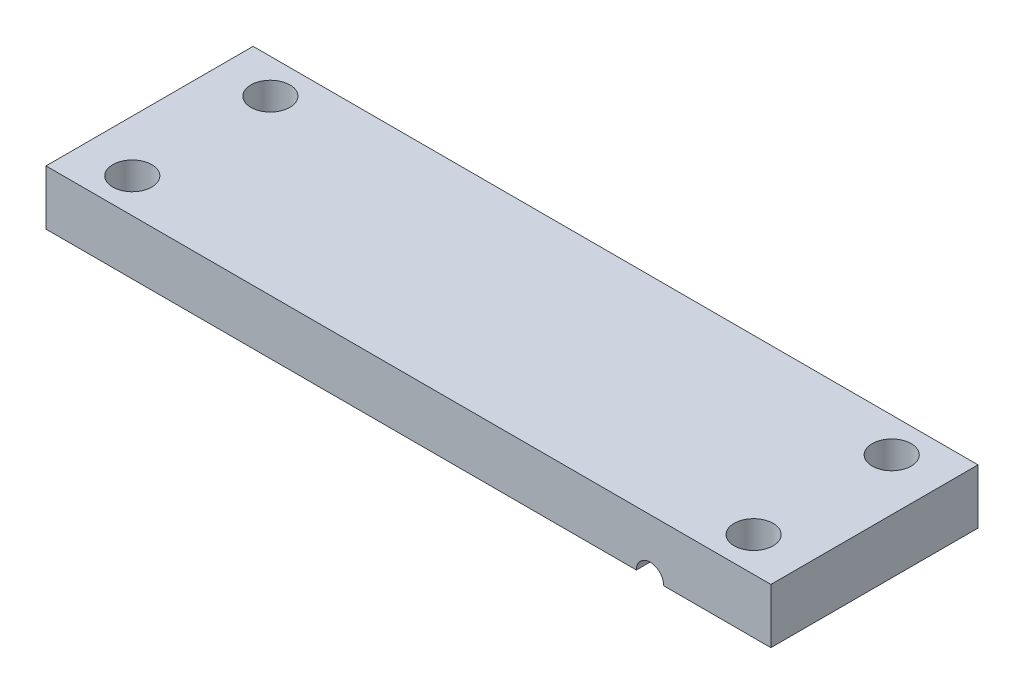
ISO-10303-21;
HEADER;
FILE_DESCRIPTION(('STEP AP214'),'2;1');
FILE_NAME('part.step','',(''),(''),'','','');
FILE_SCHEMA(('AUTOMOTIVE_DESIGN { 1 0 10303 214 1 1 1 1 }'));
ENDSEC;
DATA;
#1=APPLICATION_CONTEXT('core data for automotive mechanical design processes');
#2=APPLICATION_PROTOCOL_DEFINITION('international standard','automotive_design',2000,#1);
#3=PRODUCT_CONTEXT('',#1,'mechanical');
#4=PRODUCT('Part','Part','',(#3));
#5=PRODUCT_RELATED_PRODUCT_CATEGORY('part','',(#4));
#6=PRODUCT_DEFINITION_FORMATION('','',#4);
#7=PRODUCT_DEFINITION_CONTEXT('part definition',#1,'design');
#8=PRODUCT_DEFINITION('design','',#6,#7);
#9=PRODUCT_DEFINITION_SHAPE('','',#8);
#10=(LENGTH_UNIT() NAMED_UNIT(*) SI_UNIT(.MILLI.,.METRE.));
#11=(NAMED_UNIT(*) PLANE_ANGLE_UNIT() SI_UNIT($,.RADIAN.));
#12=(NAMED_UNIT(*) SI_UNIT($,.STERADIAN.) SOLID_ANGLE_UNIT());
#13=UNCERTAINTY_MEASURE_WITH_UNIT(LENGTH_MEASURE(1.E-05),#10,'distance_accuracy_value','');
#14=(GEOMETRIC_REPRESENTATION_CONTEXT(3) GLOBAL_UNCERTAINTY_ASSIGNED_CONTEXT((#13)) GLOBAL_UNIT_ASSIGNED_CONTEXT((#10,
#11,#12)) REPRESENTATION_CONTEXT('',''));
#15=CARTESIAN_POINT('',(0.,0.,0.));
#16=DIRECTION('',(0.,0.,1.));
#17=DIRECTION('',(1.,0.,0.));
#18=AXIS2_PLACEMENT_3D('',#15,#16,#17);
#19=CARTESIAN_POINT('',(0.,0.,0.));
#20=DIRECTION('',(0.,1.,0.));
#21=DIRECTION('',(0.,0.,1.));
#22=AXIS2_PLACEMENT_3D('',#19,#20,#21);
#23=PLANE('',#22);
#24=CARTESIAN_POINT('',(3.,0.,10.));
#25=DIRECTION('',(0.,1.,0.));
#26=DIRECTION('',(0.,0.,1.));
#27=AXIS2_PLACEMENT_3D('',#24,#25,#26);
#28=CIRCLE('',#27,1.1303);
#29=CARTESIAN_POINT('',(3.,0.,11.1303));
#30=VERTEX_POINT('',#29);
#31=EDGE_CURVE('E392',#30,#30,#28,.T.);
#32=ORIENTED_EDGE('',*,*,#31,.T.);
#33=EDGE_LOOP('',(#32));
#34=FACE_BOUND('',#33,.T.);
#35=CARTESIAN_POINT('',(3.,0.,2.));
#36=DIRECTION('',(0.,1.,0.));
#37=DIRECTION('',(0.,0.,1.));
#38=AXIS2_PLACEMENT_3D('',#35,#36,#37);
#39=CIRCLE('',#38,1.1303);
#40=CARTESIAN_POINT('',(3.,0.,3.1303));
#41=VERTEX_POINT('',#40);
#42=EDGE_CURVE('E421',#41,#41,#39,.T.);
#43=ORIENTED_EDGE('',*,*,#42,.T.);
#44=EDGE_LOOP('',(#43));
#45=FACE_BOUND('',#44,.T.);
#46=DIRECTION('',(-0.857492925712544,0.,-0.514495755427527));
#47=VECTOR('',#46,1.);
#48=CARTESIAN_POINT('',(8.81647440489951,0.,8.56422102963302));
#49=LINE('',#48,#47);
#50=CARTESIAN_POINT('',(3.4083810058706,0.,5.31936499021567));
#51=VERTEX_POINT('',#50);
#52=CARTESIAN_POINT('',(6.20625,0.,6.99808638669331));
#53=VERTEX_POINT('',#52);
#54=EDGE_CURVE('E195',#51,#53,#49,.F.);
#55=ORIENTED_EDGE('',*,*,#54,.F.);
#56=DIRECTION('',(0.514495755427527,0.,-0.857492925712544));
#57=VECTOR('',#56,1.);
#58=CARTESIAN_POINT('',(4.85294117647059,0.,2.91176470588236));
#59=LINE('',#58,#57);
#60=CARTESIAN_POINT('',(2.5916189941294,0.,6.68063500978433));
#61=VERTEX_POINT('',#60);
#62=EDGE_CURVE('E11',#61,#51,#59,.T.);
#63=ORIENTED_EDGE('',*,*,#62,.F.);
#64=DIRECTION('',(-0.857492925712544,0.,-0.514495755427527));
#65=VECTOR('',#64,1.);
#66=CARTESIAN_POINT('',(7.99971239315831,0.,9.92549104920169));
#67=LINE('',#66,#65);
#68=CARTESIAN_POINT('',(6.25483464039439,0.,8.87856439754333));
#69=VERTEX_POINT('',#68);
#70=EDGE_CURVE('E203',#69,#61,#67,.T.);
#71=ORIENTED_EDGE('',*,*,#70,.F.);
#72=CARTESIAN_POINT('',(8.5875,0.,8.4));
#73=DIRECTION('',(0.,1.,0.));
#74=DIRECTION('',(0.,0.,1.));
#75=AXIS2_PLACEMENT_3D('',#72,#73,#74);
#76=CIRCLE('',#75,2.38125);
#77=CARTESIAN_POINT('',(10.96875,0.,8.4));
#78=VERTEX_POINT('',#77);
#79=EDGE_CURVE('E218',#78,#69,#76,.F.);
#80=ORIENTED_EDGE('',*,*,#79,.F.);
#81=DIRECTION('',(0.,0.,-1.));
#82=VECTOR('',#81,1.);
#83=CARTESIAN_POINT('',(10.96875,0.,8.4));
#84=LINE('',#83,#82);
#85=CARTESIAN_POINT('',(10.96875,0.,4.9));
#86=VERTEX_POINT('',#85);
#87=EDGE_CURVE('E222',#86,#78,#84,.F.);
#88=ORIENTED_EDGE('',*,*,#87,.F.);
#89=CARTESIAN_POINT('',(11.7625,0.,4.9));
#90=DIRECTION('',(0.,-1.,0.));
#91=DIRECTION('',(0.,0.,-1.));
#92=AXIS2_PLACEMENT_3D('',#89,#90,#91);
#93=CIRCLE('',#92,0.79375);
#94=CARTESIAN_POINT('',(12.55625,0.,4.9));
#95=VERTEX_POINT('',#94);
#96=EDGE_CURVE('E497',#95,#86,#93,.F.);
#97=ORIENTED_EDGE('',*,*,#96,.F.);
#98=DIRECTION('',(0.,0.,1.));
#99=VECTOR('',#98,1.);
#100=CARTESIAN_POINT('',(12.55625,0.,4.9));
#101=LINE('',#100,#99);
#102=CARTESIAN_POINT('',(12.55625,0.,8.17500000000001));
#103=VERTEX_POINT('',#102);
#104=EDGE_CURVE('E495',#103,#95,#101,.F.);
#105=ORIENTED_EDGE('',*,*,#104,.F.);
#106=CARTESIAN_POINT('',(14.9375,0.,8.17500000000001));
#107=DIRECTION('',(0.,1.,0.));
#108=DIRECTION('',(0.,0.,1.));
#109=AXIS2_PLACEMENT_3D('',#106,#107,#108);
#110=CIRCLE('',#109,2.38125);
#111=CARTESIAN_POINT('',(16.2692519564384,0.,10.1490284417967));
#112=VERTEX_POINT('',#111);
#113=EDGE_CURVE('E493',#112,#103,#110,.F.);
#114=ORIENTED_EDGE('',*,*,#113,.F.);
#115=DIRECTION('',(0.828988322014376,0.,-0.559265913464953));
#116=VECTOR('',#115,1.);
#117=CARTESIAN_POINT('',(16.2692519564384,0.,10.1490284417967));
#118=LINE('',#117,#116);
#119=CARTESIAN_POINT('',(18.1279640307553,0.,8.89507313445872));
#120=VERTEX_POINT('',#119);
#121=EDGE_CURVE('E491',#120,#112,#118,.F.);
#122=ORIENTED_EDGE('',*,*,#121,.F.);
#123=DIRECTION('',(0.828988322014377,0.,-0.559265913464953));
#124=VECTOR('',#123,1.);
#125=CARTESIAN_POINT('',(18.1279640307553,0.,8.89507313445872));
#126=LINE('',#125,#124);
#127=CARTESIAN_POINT('',(24.7598706068703,0.,4.4209458267391));
#128=VERTEX_POINT('',#127);
#129=EDGE_CURVE('E489',#128,#120,#126,.F.);
#130=ORIENTED_EDGE('',*,*,#129,.F.);
#131=DIRECTION('',(0.828988322014376,0.,-0.559265913464954));
#132=VECTOR('',#131,1.);
#133=CARTESIAN_POINT('',(24.7598706068703,0.,4.4209458267391));
#134=LINE('',#133,#132);
#135=CARTESIAN_POINT('',(26.6185826811872,0.,3.16699051940109));
#136=VERTEX_POINT('',#135);
#137=EDGE_CURVE('E487',#136,#128,#134,.F.);
#138=ORIENTED_EDGE('',*,*,#137,.F.);
#139=CARTESIAN_POINT('',(27.0625,0.,3.825));
#140=DIRECTION('',(0.,-1.,0.));
#141=DIRECTION('',(0.,0.,-1.));
#142=AXIS2_PLACEMENT_3D('',#139,#140,#141);
#143=CIRCLE('',#142,0.793750000000003);
#144=CARTESIAN_POINT('',(27.85625,0.,3.825));
#145=VERTEX_POINT('',#144);
#146=EDGE_CURVE('E485',#145,#136,#143,.F.);
#147=ORIENTED_EDGE('',*,*,#146,.F.);
#148=DIRECTION('',(0.,0.,1.));
#149=VECTOR('',#148,1.);
#150=CARTESIAN_POINT('',(27.85625,0.,3.825));
#151=LINE('',#150,#149);
#152=CARTESIAN_POINT('',(27.85625,0.,8.4));
#153=VERTEX_POINT('',#152);
#154=EDGE_CURVE('E483',#153,#145,#151,.F.);
#155=ORIENTED_EDGE('',*,*,#154,.F.);
#156=CARTESIAN_POINT('',(30.2375,0.,8.4));
#157=DIRECTION('',(0.,1.,0.));
#158=DIRECTION('',(0.,0.,1.));
#159=AXIS2_PLACEMENT_3D('',#156,#157,#158);
#160=CIRCLE('',#159,2.38125);
#161=CARTESIAN_POINT('',(32.61875,0.,8.4));
#162=VERTEX_POINT('',#161);
#163=EDGE_CURVE('E481',#162,#153,#160,.F.);
#164=ORIENTED_EDGE('',*,*,#163,.F.);
#165=DIRECTION('',(0.,0.,-1.));
#166=VECTOR('',#165,1.);
#167=CARTESIAN_POINT('',(32.61875,0.,8.4));
#168=LINE('',#167,#166);
#169=CARTESIAN_POINT('',(32.61875,0.,3.6));
#170=VERTEX_POINT('',#169);
#171=EDGE_CURVE('E479',#170,#162,#168,.F.);
#172=ORIENTED_EDGE('',*,*,#171,.F.);
#173=CARTESIAN_POINT('',(33.4125,0.,3.59999999999999));
#174=DIRECTION('',(0.,-1.,0.));
#175=DIRECTION('',(0.,0.,-1.));
#176=AXIS2_PLACEMENT_3D('',#173,#174,#175);
#177=CIRCLE('',#176,0.793750000000005);
#178=CARTESIAN_POINT('',(34.20625,0.,3.59999999999997));
#179=VERTEX_POINT('',#178);
#180=EDGE_CURVE('E477',#179,#170,#177,.F.);
#181=ORIENTED_EDGE('',*,*,#180,.F.);
#182=DIRECTION('',(0.,0.,1.));
#183=VECTOR('',#182,1.);
#184=CARTESIAN_POINT('',(34.20625,0.,3.59999999999998));
#185=LINE('',#184,#183);
#186=CARTESIAN_POINT('',(34.20625,0.,12.));
#187=VERTEX_POINT('',#186);
#188=EDGE_CURVE('E475',#187,#179,#185,.F.);
#189=ORIENTED_EDGE('',*,*,#188,.F.);
#190=DIRECTION('',(1.,0.,0.));
#191=VECTOR('',#190,1.);
#192=CARTESIAN_POINT('',(0.,0.,12.));
#193=LINE('',#192,#191);
#194=CARTESIAN_POINT('',(0.,0.,12.));
#195=VERTEX_POINT('',#194);
#196=EDGE_CURVE('E397',#195,#187,#193,.T.);
#197=ORIENTED_EDGE('',*,*,#196,.F.);
#198=DIRECTION('',(0.,0.,1.));
#199=VECTOR('',#198,1.);
#200=CARTESIAN_POINT('',(0.,0.,0.));
#201=LINE('',#200,#199);
#202=CARTESIAN_POINT('',(0.,0.,0.));
#203=VERTEX_POINT('',#202);
#204=EDGE_CURVE('E429',#203,#195,#201,.T.);
#205=ORIENTED_EDGE('',*,*,#204,.F.);
#206=DIRECTION('',(1.,0.,0.));
#207=VECTOR('',#206,1.);
#208=CARTESIAN_POINT('',(0.,0.,0.));
#209=LINE('',#208,#207);
#210=CARTESIAN_POINT('',(6.20625,0.,0.));
#211=VERTEX_POINT('',#210);
#212=EDGE_CURVE('E216',#203,#211,#209,.T.);
#213=ORIENTED_EDGE('',*,*,#212,.T.);
#214=DIRECTION('',(0.,0.,1.));
#215=VECTOR('',#214,1.);
#216=CARTESIAN_POINT('',(6.20625,0.,-5.));
#217=LINE('',#216,#215);
#218=EDGE_CURVE('E208',#53,#211,#217,.F.);
#219=ORIENTED_EDGE('',*,*,#218,.F.);
#220=EDGE_LOOP('',(#55,#63,#71,#80,#88,#97,#105,#114,#122,#130,#138,#147,#155,#164,#172,#181,
#189,#197,#205,#213,#219));
#221=FACE_BOUND('',#220,.T.);
#222=ADVANCED_FACE('F35',(#34,#45,#221),#23,.F.);
#223=CARTESIAN_POINT('',(7.,0.,-5.));
#224=DIRECTION('',(0.,0.,1.));
#225=DIRECTION('',(1.,0.,0.));
#226=AXIS2_PLACEMENT_3D('',#223,#224,#225);
#227=CYLINDRICAL_SURFACE('',#226,0.79375);
#228=CARTESIAN_POINT('',(7.,0.,8.4));
#229=DIRECTION('',(0.,0.,-1.));
#230=DIRECTION('',(-1.,0.,0.));
#231=AXIS2_PLACEMENT_3D('',#228,#229,#230);
#232=CIRCLE('',#231,0.79375);
#233=CARTESIAN_POINT('',(7.,0.79375,8.4));
#234=VERTEX_POINT('',#233);
#235=CARTESIAN_POINT('',(7.79375,0.,8.4));
#236=VERTEX_POINT('',#235);
#237=EDGE_CURVE('E211',#234,#236,#232,.T.);
#238=ORIENTED_EDGE('',*,*,#237,.F.);
#239=CARTESIAN_POINT('',(7.,0.,8.4));
#240=DIRECTION('',(-0.870199906753479,0.,0.492698814983593));
#241=DIRECTION('',(0.492698814983593,0.,0.870199906753479));
#242=AXIS2_PLACEMENT_3D('',#239,#240,#241);
#243=ELLIPSE('',#242,1.61102477996915,0.793750000000001);
#244=EDGE_CURVE('E50',#234,#53,#243,.T.);
#245=ORIENTED_EDGE('',*,*,#244,.T.);
#246=ORIENTED_EDGE('',*,*,#218,.T.);
#247=CARTESIAN_POINT('',(7.,0.,0.));
#248=DIRECTION('',(0.,0.,-1.));
#249=DIRECTION('',(-1.,0.,0.));
#250=AXIS2_PLACEMENT_3D('',#247,#248,#249);
#251=CIRCLE('',#250,0.79375);
#252=CARTESIAN_POINT('',(7.79375,0.,0.));
#253=VERTEX_POINT('',#252);
#254=EDGE_CURVE('E352',#211,#253,#251,.T.);
#255=ORIENTED_EDGE('',*,*,#254,.T.);
#256=DIRECTION('',(0.,0.,1.));
#257=VECTOR('',#256,1.);
#258=CARTESIAN_POINT('',(7.79375,0.,-5.));
#259=LINE('',#258,#257);
#260=EDGE_CURVE('E473',#253,#236,#259,.T.);
#261=ORIENTED_EDGE('',*,*,#260,.T.);
#262=EDGE_LOOP('',(#238,#245,#246,#255,#261));
#263=FACE_BOUND('',#262,.T.);
#264=ADVANCED_FACE('F207',(#263),#227,.F.);
#265=CARTESIAN_POINT('',(8.5875,0.,8.4));
#266=DIRECTION('',(0.,1.,0.));
#267=DIRECTION('',(0.,0.,1.));
#268=AXIS2_PLACEMENT_3D('',#265,#266,#267);
#269=TOROIDAL_SURFACE('',#268,1.5875,0.79375);
#270=ORIENTED_EDGE('',*,*,#79,.T.);
#271=CARTESIAN_POINT('',(6.25483466285203,-0.0002,8.87856438163359));
#272=CARTESIAN_POINT('',(6.25482962570926,0.0207003300208054,8.87856835918364));
#273=CARTESIAN_POINT('',(6.25556152804994,0.0415904535670495,8.87804940071853));
#274=CARTESIAN_POINT('',(6.25848753581826,0.0832124382935572,8.87597735658965));
#275=CARTESIAN_POINT('',(6.26068135869519,0.103944329273006,8.87442447075685));
#276=CARTESIAN_POINT('',(6.26941763797564,0.165560061379677,8.86824707092123));
#277=CARTESIAN_POINT('',(6.27811507212049,0.206016138347598,8.86210364935839));
#278=CARTESIAN_POINT('',(6.30094564146722,0.284536279106685,8.84605417109004));
#279=CARTESIAN_POINT('',(6.31507757362076,0.322600870138907,8.83614894715008));
#280=CARTESIAN_POINT('',(6.34830110255609,0.395420038120628,8.81301696458442));
#281=CARTESIAN_POINT('',(6.36739441774565,0.430173462514673,8.79978905517766));
#282=CARTESIAN_POINT('',(6.41058259047797,0.496565453680797,8.77012232089871));
#283=CARTESIAN_POINT('',(6.43480988172102,0.528079873880654,8.75359934237196));
#284=CARTESIAN_POINT('',(6.48718187663256,0.586173780560721,8.71826521637241));
#285=CARTESIAN_POINT('',(6.51532758091398,0.612752002465432,8.69945348459471));
#286=CARTESIAN_POINT('',(6.57713402751374,0.66246274058662,8.65867073611243));
#287=CARTESIAN_POINT('',(6.61105380131255,0.685164133390054,8.63656772648038));
#288=CARTESIAN_POINT('',(6.68173264095615,0.724165660992231,8.59125803592129));
#289=CARTESIAN_POINT('',(6.71849359364501,0.740461497344504,8.56805062555456));
#290=CARTESIAN_POINT('',(6.79450378110929,0.766775741575327,8.52096530588557));
#291=CARTESIAN_POINT('',(6.83377962230345,0.776707710813487,8.49708258358337));
#292=CARTESIAN_POINT('',(6.91353624754079,0.790043950370583,8.4496454554762));
#293=CARTESIAN_POINT('',(6.95401467884294,0.793460210890941,8.42609052594994));
#294=CARTESIAN_POINT('',(6.99647047435966,0.793744126088749,8.40199947767884));
#295=CARTESIAN_POINT('',(6.99823505408757,0.7937500138393,8.40099928870685));
#296=CARTESIAN_POINT('',(7.,0.793750000000004,8.4));
#297=B_SPLINE_CURVE_WITH_KNOTS('',3,(#271,#272,#273,#274,#275,#276,#277,#278,#279,#280,#281,
#282,#283,#284,#285,#286,#287,#288,#289,#290,#291,#292,#293,#294,#295,#296),.UNSPECIFIED.,.F.,
.F.,(4,2,2,2,2,2,2,2,2,2,2,2,4),(0.,0.0626609515643968,0.12530979592917,0.250156990694407,
0.374976563621033,0.499839426389802,0.628434304211971,0.757062080690763,0.895733942728813,
1.03449870225722,1.17511040337893,1.31546310037207,1.32154807079446),.UNSPECIFIED.);
#298=EDGE_CURVE('E43',#69,#234,#297,.T.);
#299=ORIENTED_EDGE('',*,*,#298,.T.);
#300=ORIENTED_EDGE('',*,*,#237,.T.);
#301=CARTESIAN_POINT('',(8.5875,0.,8.4));
#302=DIRECTION('',(0.,-1.,0.));
#303=DIRECTION('',(0.,0.,-1.));
#304=AXIS2_PLACEMENT_3D('',#301,#302,#303);
#305=CIRCLE('',#304,0.79375);
#306=CARTESIAN_POINT('',(9.38125,0.,8.4));
#307=VERTEX_POINT('',#306);
#308=EDGE_CURVE('E471',#236,#307,#305,.F.);
#309=ORIENTED_EDGE('',*,*,#308,.T.);
#310=CARTESIAN_POINT('',(10.175,0.,8.4));
#311=DIRECTION('',(0.,0.,1.));
#312=DIRECTION('',(1.,0.,0.));
#313=AXIS2_PLACEMENT_3D('',#310,#311,#312);
#314=CIRCLE('',#313,0.79375);
#315=EDGE_CURVE('E346',#78,#307,#314,.T.);
#316=ORIENTED_EDGE('',*,*,#315,.F.);
#317=EDGE_LOOP('',(#270,#299,#300,#309,#316));
#318=FACE_BOUND('',#317,.T.);
#319=ADVANCED_FACE('F231',(#318),#269,.F.);
#320=CARTESIAN_POINT('',(39.,0.,2.));
#321=DIRECTION('',(0.,1.,0.));
#322=DIRECTION('',(0.,0.,1.));
#323=AXIS2_PLACEMENT_3D('',#320,#321,#322);
#324=CIRCLE('',#323,1.1303);
#325=CARTESIAN_POINT('',(39.,0.,3.1303));
#326=VERTEX_POINT('',#325);
#327=EDGE_CURVE('E336',#326,#326,#324,.T.);
#328=ORIENTED_EDGE('',*,*,#327,.T.);
#329=EDGE_LOOP('',(#328));
#330=FACE_BOUND('',#329,.T.);
#331=CARTESIAN_POINT('',(39.,0.,10.));
#332=DIRECTION('',(0.,1.,0.));
#333=DIRECTION('',(0.,0.,1.));
#334=AXIS2_PLACEMENT_3D('',#331,#332,#333);
#335=CIRCLE('',#334,1.1303);
#336=CARTESIAN_POINT('',(39.,0.,11.1303));
#337=VERTEX_POINT('',#336);
#338=EDGE_CURVE('E340',#337,#337,#335,.T.);
#339=ORIENTED_EDGE('',*,*,#338,.T.);
#340=EDGE_LOOP('',(#339));
#341=FACE_BOUND('',#340,.T.);
#342=DIRECTION('',(0.857492925712542,0.,0.514495755427531));
#343=VECTOR('',#342,1.);
#344=CARTESIAN_POINT('',(33.1835255951005,0.,3.43577897036696));
#345=LINE('',#344,#343);
#346=CARTESIAN_POINT('',(38.5916189941294,0.,6.68063500978433));
#347=VERTEX_POINT('',#346);
#348=CARTESIAN_POINT('',(35.79375,0.,5.00191361330668));
#349=VERTEX_POINT('',#348);
#350=EDGE_CURVE('E58',#347,#349,#345,.F.);
#351=ORIENTED_EDGE('',*,*,#350,.F.);
#352=DIRECTION('',(-0.514495755427531,0.,0.857492925712542));
#353=VECTOR('',#352,1.);
#354=CARTESIAN_POINT('',(31.3235294117646,0.,18.7941176470589));
#355=LINE('',#354,#353);
#356=CARTESIAN_POINT('',(39.4083810058706,0.,5.31936499021567));
#357=VERTEX_POINT('',#356);
#358=EDGE_CURVE('E217',#357,#347,#355,.T.);
#359=ORIENTED_EDGE('',*,*,#358,.F.);
#360=DIRECTION('',(0.857492925712542,0.,0.514495755427531));
#361=VECTOR('',#360,1.);
#362=CARTESIAN_POINT('',(34.0002876068417,0.,2.0745089507983));
#363=LINE('',#362,#361);
#364=CARTESIAN_POINT('',(35.7451653596056,0.,3.12143560245665));
#365=VERTEX_POINT('',#364);
#366=EDGE_CURVE('E258',#365,#357,#363,.T.);
#367=ORIENTED_EDGE('',*,*,#366,.F.);
#368=CARTESIAN_POINT('',(33.4125,0.,3.59999999999999));
#369=DIRECTION('',(0.,1.,0.));
#370=DIRECTION('',(0.,0.,1.));
#371=AXIS2_PLACEMENT_3D('',#368,#369,#370);
#372=CIRCLE('',#371,2.38125000000001);
#373=CARTESIAN_POINT('',(31.03125,0.,3.6));
#374=VERTEX_POINT('',#373);
#375=EDGE_CURVE('E446',#374,#365,#372,.F.);
#376=ORIENTED_EDGE('',*,*,#375,.F.);
#377=DIRECTION('',(0.,0.,-1.));
#378=VECTOR('',#377,1.);
#379=CARTESIAN_POINT('',(31.03125,0.,8.4));
#380=LINE('',#379,#378);
#381=CARTESIAN_POINT('',(31.03125,0.,8.4));
#382=VERTEX_POINT('',#381);
#383=EDGE_CURVE('E449',#382,#374,#380,.T.);
#384=ORIENTED_EDGE('',*,*,#383,.F.);
#385=CARTESIAN_POINT('',(30.2375,0.,8.4));
#386=DIRECTION('',(0.,-1.,0.));
#387=DIRECTION('',(0.,0.,-1.));
#388=AXIS2_PLACEMENT_3D('',#385,#386,#387);
#389=CIRCLE('',#388,0.793749999999998);
#390=CARTESIAN_POINT('',(29.44375,0.,8.4));
#391=VERTEX_POINT('',#390);
#392=EDGE_CURVE('E451',#391,#382,#389,.F.);
#393=ORIENTED_EDGE('',*,*,#392,.F.);
#394=DIRECTION('',(0.,0.,1.));
#395=VECTOR('',#394,1.);
#396=CARTESIAN_POINT('',(29.44375,0.,3.825));
#397=LINE('',#396,#395);
#398=CARTESIAN_POINT('',(29.44375,0.,3.825));
#399=VERTEX_POINT('',#398);
#400=EDGE_CURVE('E453',#399,#391,#397,.T.);
#401=ORIENTED_EDGE('',*,*,#400,.F.);
#402=CARTESIAN_POINT('',(27.0625,0.,3.825));
#403=DIRECTION('',(0.,1.,0.));
#404=DIRECTION('',(0.,0.,1.));
#405=AXIS2_PLACEMENT_3D('',#402,#403,#404);
#406=CIRCLE('',#405,2.38125);
#407=CARTESIAN_POINT('',(25.7307480435616,0.,1.85097155820326));
#408=VERTEX_POINT('',#407);
#409=EDGE_CURVE('E455',#408,#399,#406,.F.);
#410=ORIENTED_EDGE('',*,*,#409,.F.);
#411=DIRECTION('',(0.828988322014376,0.,-0.559265913464954));
#412=VECTOR('',#411,1.);
#413=CARTESIAN_POINT('',(23.8720359692447,0.,3.10492686554127));
#414=LINE('',#413,#412);
#415=CARTESIAN_POINT('',(23.8720359692447,0.,3.10492686554127));
#416=VERTEX_POINT('',#415);
#417=EDGE_CURVE('E457',#416,#408,#414,.T.);
#418=ORIENTED_EDGE('',*,*,#417,.F.);
#419=DIRECTION('',(0.828988322014377,0.,-0.559265913464953));
#420=VECTOR('',#419,1.);
#421=CARTESIAN_POINT('',(17.2401293931297,0.,7.5790541732609));
#422=LINE('',#421,#420);
#423=CARTESIAN_POINT('',(17.2401293931297,0.,7.5790541732609));
#424=VERTEX_POINT('',#423);
#425=EDGE_CURVE('E459',#424,#416,#422,.T.);
#426=ORIENTED_EDGE('',*,*,#425,.F.);
#427=DIRECTION('',(0.828988322014376,0.,-0.559265913464953));
#428=VECTOR('',#427,1.);
#429=CARTESIAN_POINT('',(15.3814173188128,0.,8.83300948059892));
#430=LINE('',#429,#428);
#431=CARTESIAN_POINT('',(15.3814173188128,0.,8.83300948059892));
#432=VERTEX_POINT('',#431);
#433=EDGE_CURVE('E461',#432,#424,#430,.T.);
#434=ORIENTED_EDGE('',*,*,#433,.F.);
#435=CARTESIAN_POINT('',(14.9375,0.,8.17500000000001));
#436=DIRECTION('',(0.,-1.,0.));
#437=DIRECTION('',(0.,0.,-1.));
#438=AXIS2_PLACEMENT_3D('',#435,#436,#437);
#439=CIRCLE('',#438,0.793750000000002);
#440=CARTESIAN_POINT('',(14.14375,0.,8.17500000000001));
#441=VERTEX_POINT('',#440);
#442=EDGE_CURVE('E463',#441,#432,#439,.F.);
#443=ORIENTED_EDGE('',*,*,#442,.F.);
#444=DIRECTION('',(0.,0.,1.));
#445=VECTOR('',#444,1.);
#446=CARTESIAN_POINT('',(14.14375,0.,4.9));
#447=LINE('',#446,#445);
#448=CARTESIAN_POINT('',(14.14375,0.,4.9));
#449=VERTEX_POINT('',#448);
#450=EDGE_CURVE('E465',#449,#441,#447,.T.);
#451=ORIENTED_EDGE('',*,*,#450,.F.);
#452=CARTESIAN_POINT('',(11.7625,0.,4.9));
#453=DIRECTION('',(0.,1.,0.));
#454=DIRECTION('',(0.,0.,1.));
#455=AXIS2_PLACEMENT_3D('',#452,#453,#454);
#456=CIRCLE('',#455,2.38125);
#457=CARTESIAN_POINT('',(9.38125,0.,4.9));
#458=VERTEX_POINT('',#457);
#459=EDGE_CURVE('E467',#458,#449,#456,.F.);
#460=ORIENTED_EDGE('',*,*,#459,.F.);
#461=DIRECTION('',(0.,0.,-1.));
#462=VECTOR('',#461,1.);
#463=CARTESIAN_POINT('',(9.38125,0.,8.4));
#464=LINE('',#463,#462);
#465=EDGE_CURVE('E469',#307,#458,#464,.T.);
#466=ORIENTED_EDGE('',*,*,#465,.F.);
#467=ORIENTED_EDGE('',*,*,#308,.F.);
#468=ORIENTED_EDGE('',*,*,#260,.F.);
#469=CARTESIAN_POINT('',(42.,0.,0.));
#470=VERTEX_POINT('',#469);
#471=EDGE_CURVE('E427',#253,#470,#209,.T.);
#472=ORIENTED_EDGE('',*,*,#471,.T.);
#473=DIRECTION('',(0.,0.,1.));
#474=VECTOR('',#473,1.);
#475=CARTESIAN_POINT('',(42.,0.,0.));
#476=LINE('',#475,#474);
#477=CARTESIAN_POINT('',(42.,0.,12.));
#478=VERTEX_POINT('',#477);
#479=EDGE_CURVE('E424',#470,#478,#476,.T.);
#480=ORIENTED_EDGE('',*,*,#479,.T.);
#481=CARTESIAN_POINT('',(35.79375,0.,12.));
#482=VERTEX_POINT('',#481);
#483=EDGE_CURVE('E432',#482,#478,#193,.T.);
#484=ORIENTED_EDGE('',*,*,#483,.F.);
#485=DIRECTION('',(0.,0.,1.));
#486=VECTOR('',#485,1.);
#487=CARTESIAN_POINT('',(35.79375,0.,3.59999999999998));
#488=LINE('',#487,#486);
#489=EDGE_CURVE('E345',#349,#482,#488,.T.);
#490=ORIENTED_EDGE('',*,*,#489,.F.);
#491=EDGE_LOOP('',(#351,#359,#367,#376,#384,#393,#401,#410,#418,#426,#434,#443,#451,#460,#466,
#467,#468,#472,#480,#484,#490));
#492=FACE_BOUND('',#491,.T.);
#493=ADVANCED_FACE('F267',(#330,#341,#492),#23,.F.);
#494=CARTESIAN_POINT('',(33.4125,0.,3.59999999999999));
#495=DIRECTION('',(0.,-1.,0.));
#496=DIRECTION('',(0.,0.,-1.));
#497=AXIS2_PLACEMENT_3D('',#494,#495,#496);
#498=TOROIDAL_SURFACE('',#497,1.58750000000001,0.79375);
#499=ORIENTED_EDGE('',*,*,#375,.T.);
#500=CARTESIAN_POINT('',(35.745165337148,-0.0002,3.12143561836639));
#501=CARTESIAN_POINT('',(35.7451703742907,0.0207003300208057,3.12143164081634));
#502=CARTESIAN_POINT('',(35.7444384719501,0.0415904535670502,3.12195059928145));
#503=CARTESIAN_POINT('',(35.7415124641817,0.0832124382935584,3.12402264341033));
#504=CARTESIAN_POINT('',(35.7393186413048,0.103944329273007,3.12557552924313));
#505=CARTESIAN_POINT('',(35.7305823620244,0.165560061379678,3.13175292907875));
#506=CARTESIAN_POINT('',(35.7218849278795,0.206016138347598,3.13789635064159));
#507=CARTESIAN_POINT('',(35.6990543585328,0.284536279106684,3.15394582890995));
#508=CARTESIAN_POINT('',(35.6849224263792,0.322600870138906,3.1638510528499));
#509=CARTESIAN_POINT('',(35.6516988974439,0.395420038120627,3.18698303541556));
#510=CARTESIAN_POINT('',(35.6326055822544,0.430173462514672,3.20021094482232));
#511=CARTESIAN_POINT('',(35.589417409522,0.496565453680798,3.22987767910127));
#512=CARTESIAN_POINT('',(35.565190118279,0.528079873880657,3.24640065762802));
#513=CARTESIAN_POINT('',(35.5128181233675,0.586173780560725,3.28173478362757));
#514=CARTESIAN_POINT('',(35.484672419086,0.612752002465436,3.30054651540528));
#515=CARTESIAN_POINT('',(35.4228659724863,0.662462740586619,3.34132926388755));
#516=CARTESIAN_POINT('',(35.3889461986874,0.685164133390048,3.36343227351957));
#517=CARTESIAN_POINT('',(35.3182673590439,0.724165660992226,3.40874196407872));
#518=CARTESIAN_POINT('',(35.2815064063551,0.740461497344502,3.43194937444553));
#519=CARTESIAN_POINT('',(35.2054962188906,0.766775741575331,3.47903469411431));
#520=CARTESIAN_POINT('',(35.1662203776963,0.776707710813491,3.50291741641619));
#521=CARTESIAN_POINT('',(35.0864637524595,0.790043950370584,3.55035454452424));
#522=CARTESIAN_POINT('',(35.045985321158,0.793460210890939,3.5739094740517));
#523=CARTESIAN_POINT('',(35.0035295256404,0.793744126088748,3.59800052232129));
#524=CARTESIAN_POINT('',(35.0017649459125,0.793750013839299,3.5990007112932));
#525=CARTESIAN_POINT('',(35.,0.793750000000004,3.59999999999997));
#526=B_SPLINE_CURVE_WITH_KNOTS('',3,(#500,#501,#502,#503,#504,#505,#506,#507,#508,#509,#510,
#511,#512,#513,#514,#515,#516,#517,#518,#519,#520,#521,#522,#523,#524,#525),.UNSPECIFIED.,.F.,
.F.,(4,2,2,2,2,2,2,2,2,2,2,2,4),(0.,0.0626609515643978,0.125309795929171,0.250156990694407,
0.374976563621029,0.4998394263898,0.628434304211979,0.757062080690765,0.895733942728791,
1.03449870225722,1.17511040337896,1.31546310037207,1.32154807079445),.UNSPECIFIED.);
#527=CARTESIAN_POINT('',(35.,0.79375,3.59999999999997));
#528=VERTEX_POINT('',#527);
#529=EDGE_CURVE('E249',#365,#528,#526,.T.);
#530=ORIENTED_EDGE('',*,*,#529,.T.);
#531=CARTESIAN_POINT('',(35.,0.,3.59999999999997));
#532=DIRECTION('',(0.,0.,-1.));
#533=DIRECTION('',(-1.,0.,0.));
#534=AXIS2_PLACEMENT_3D('',#531,#532,#533);
#535=CIRCLE('',#534,0.79375);
#536=EDGE_CURVE('E349',#179,#528,#535,.T.);
#537=ORIENTED_EDGE('',*,*,#536,.F.);
#538=ORIENTED_EDGE('',*,*,#180,.T.);
#539=CARTESIAN_POINT('',(31.825,0.,3.6));
#540=DIRECTION('',(0.,0.,1.));
#541=DIRECTION('',(1.,0.,0.));
#542=AXIS2_PLACEMENT_3D('',#539,#540,#541);
#543=CIRCLE('',#542,0.79375);
#544=EDGE_CURVE('E353',#170,#374,#543,.T.);
#545=ORIENTED_EDGE('',*,*,#544,.T.);
#546=EDGE_LOOP('',(#499,#530,#537,#538,#545));
#547=FACE_BOUND('',#546,.T.);
#548=ADVANCED_FACE('F262',(#547),#498,.F.);
#549=CARTESIAN_POINT('',(35.,0.,3.59999999999998));
#550=DIRECTION('',(0.,0.,1.));
#551=DIRECTION('',(1.,0.,0.));
#552=AXIS2_PLACEMENT_3D('',#549,#550,#551);
#553=CYLINDRICAL_SURFACE('',#552,0.79375);
#554=ORIENTED_EDGE('',*,*,#536,.T.);
#555=CARTESIAN_POINT('',(35.,0.,3.59999999999997));
#556=DIRECTION('',(0.87019990675348,0.,-0.492698814983591));
#557=DIRECTION('',(-0.492698814983591,0.,-0.87019990675348));
#558=AXIS2_PLACEMENT_3D('',#555,#556,#557);
#559=ELLIPSE('',#558,1.61102477996915,0.79375);
#560=EDGE_CURVE('E259',#528,#349,#559,.T.);
#561=ORIENTED_EDGE('',*,*,#560,.T.);
#562=ORIENTED_EDGE('',*,*,#489,.T.);
#563=CARTESIAN_POINT('',(35.,0.,12.));
#564=DIRECTION('',(0.,0.,-1.));
#565=DIRECTION('',(-1.,0.,0.));
#566=AXIS2_PLACEMENT_3D('',#563,#564,#565);
#567=CIRCLE('',#566,0.79375);
#568=EDGE_CURVE('E389',#187,#482,#567,.T.);
#569=ORIENTED_EDGE('',*,*,#568,.F.);
#570=ORIENTED_EDGE('',*,*,#188,.T.);
#571=EDGE_LOOP('',(#554,#561,#562,#569,#570));
#572=FACE_BOUND('',#571,.T.);
#573=ADVANCED_FACE('F266',(#572),#553,.F.);
#574=CARTESIAN_POINT('',(42.,3.175,0.));
#575=DIRECTION('',(1.,0.,0.));
#576=DIRECTION('',(0.,0.,-1.));
#577=AXIS2_PLACEMENT_3D('',#574,#575,#576);
#578=PLANE('',#577);
#579=ORIENTED_EDGE('',*,*,#479,.F.);
#580=DIRECTION('',(0.,-1.,0.));
#581=VECTOR('',#580,1.);
#582=CARTESIAN_POINT('',(42.,3.175,0.));
#583=LINE('',#582,#581);
#584=CARTESIAN_POINT('',(42.,3.175,0.));
#585=VERTEX_POINT('',#584);
#586=EDGE_CURVE('E442',#585,#470,#583,.T.);
#587=ORIENTED_EDGE('',*,*,#586,.F.);
#588=DIRECTION('',(0.,0.,1.));
#589=VECTOR('',#588,1.);
#590=CARTESIAN_POINT('',(42.,3.175,0.));
#591=LINE('',#590,#589);
#592=CARTESIAN_POINT('',(42.,3.175,12.));
#593=VERTEX_POINT('',#592);
#594=EDGE_CURVE('E406',#585,#593,#591,.T.);
#595=ORIENTED_EDGE('',*,*,#594,.T.);
#596=DIRECTION('',(0.,-1.,0.));
#597=VECTOR('',#596,1.);
#598=CARTESIAN_POINT('',(42.,3.175,12.));
#599=LINE('',#598,#597);
#600=EDGE_CURVE('E417',#593,#478,#599,.T.);
#601=ORIENTED_EDGE('',*,*,#600,.T.);
#602=EDGE_LOOP('',(#579,#587,#595,#601));
#603=FACE_BOUND('',#602,.T.);
#604=ADVANCED_FACE('F552',(#603),#578,.T.);
#605=CARTESIAN_POINT('',(0.,3.175,0.));
#606=DIRECTION('',(0.,0.,-1.));
#607=DIRECTION('',(-1.,0.,0.));
#608=AXIS2_PLACEMENT_3D('',#605,#606,#607);
#609=PLANE('',#608);
#610=ORIENTED_EDGE('',*,*,#471,.F.);
#611=ORIENTED_EDGE('',*,*,#254,.F.);
#612=ORIENTED_EDGE('',*,*,#212,.F.);
#613=DIRECTION('',(0.,-1.,0.));
#614=VECTOR('',#613,1.);
#615=CARTESIAN_POINT('',(0.,3.175,0.));
#616=LINE('',#615,#614);
#617=CARTESIAN_POINT('',(0.,3.175,0.));
#618=VERTEX_POINT('',#617);
#619=EDGE_CURVE('E440',#618,#203,#616,.T.);
#620=ORIENTED_EDGE('',*,*,#619,.F.);
#621=DIRECTION('',(1.,0.,0.));
#622=VECTOR('',#621,1.);
#623=CARTESIAN_POINT('',(0.,3.175,0.));
#624=LINE('',#623,#622);
#625=EDGE_CURVE('E409',#618,#585,#624,.T.);
#626=ORIENTED_EDGE('',*,*,#625,.T.);
#627=ORIENTED_EDGE('',*,*,#586,.T.);
#628=EDGE_LOOP('',(#610,#611,#612,#620,#626,#627));
#629=FACE_BOUND('',#628,.T.);
#630=ADVANCED_FACE('F547',(#629),#609,.T.);
#631=CARTESIAN_POINT('',(0.,3.175,0.));
#632=DIRECTION('',(1.,0.,0.));
#633=DIRECTION('',(0.,0.,-1.));
#634=AXIS2_PLACEMENT_3D('',#631,#632,#633);
#635=PLANE('',#634);
#636=ORIENTED_EDGE('',*,*,#204,.T.);
#637=DIRECTION('',(0.,-1.,0.));
#638=VECTOR('',#637,1.);
#639=CARTESIAN_POINT('',(0.,3.175,12.));
#640=LINE('',#639,#638);
#641=CARTESIAN_POINT('',(0.,3.175,12.));
#642=VERTEX_POINT('',#641);
#643=EDGE_CURVE('E437',#642,#195,#640,.T.);
#644=ORIENTED_EDGE('',*,*,#643,.F.);
#645=DIRECTION('',(0.,0.,1.));
#646=VECTOR('',#645,1.);
#647=CARTESIAN_POINT('',(0.,3.175,0.));
#648=LINE('',#647,#646);
#649=EDGE_CURVE('E412',#618,#642,#648,.T.);
#650=ORIENTED_EDGE('',*,*,#649,.F.);
#651=ORIENTED_EDGE('',*,*,#619,.T.);
#652=EDGE_LOOP('',(#636,#644,#650,#651));
#653=FACE_BOUND('',#652,.T.);
#654=ADVANCED_FACE('F558',(#653),#635,.F.);
#655=CARTESIAN_POINT('',(3.,3.175,2.));
#656=DIRECTION('',(0.,-1.,0.));
#657=DIRECTION('',(0.,0.,-1.));
#658=AXIS2_PLACEMENT_3D('',#655,#656,#657);
#659=CYLINDRICAL_SURFACE('',#658,1.1303);
#660=CARTESIAN_POINT('',(3.,3.175,2.));
#661=DIRECTION('',(0.,1.,0.));
#662=DIRECTION('',(0.,0.,1.));
#663=AXIS2_PLACEMENT_3D('',#660,#661,#662);
#664=CIRCLE('',#663,1.1303);
#665=CARTESIAN_POINT('',(3.,3.175,3.1303));
#666=VERTEX_POINT('',#665);
#667=EDGE_CURVE('E403',#666,#666,#664,.T.);
#668=ORIENTED_EDGE('',*,*,#667,.T.);
#669=EDGE_LOOP('',(#668));
#670=FACE_BOUND('',#669,.T.);
#671=ORIENTED_EDGE('',*,*,#42,.F.);
#672=EDGE_LOOP('',(#671));
#673=FACE_BOUND('',#672,.T.);
#674=ADVANCED_FACE('F561',(#670,#673),#659,.F.);
#675=CARTESIAN_POINT('',(39.,3.175,10.));
#676=DIRECTION('',(0.,-1.,0.));
#677=DIRECTION('',(0.,0.,-1.));
#678=AXIS2_PLACEMENT_3D('',#675,#676,#677);
#679=CYLINDRICAL_SURFACE('',#678,1.1303);
#680=CARTESIAN_POINT('',(39.,3.175,10.));
#681=DIRECTION('',(0.,1.,0.));
#682=DIRECTION('',(0.,0.,1.));
#683=AXIS2_PLACEMENT_3D('',#680,#681,#682);
#684=CIRCLE('',#683,1.1303);
#685=CARTESIAN_POINT('',(39.,3.175,11.1303));
#686=VERTEX_POINT('',#685);
#687=EDGE_CURVE('E400',#686,#686,#684,.T.);
#688=ORIENTED_EDGE('',*,*,#687,.T.);
#689=EDGE_LOOP('',(#688));
#690=FACE_BOUND('',#689,.T.);
#691=ORIENTED_EDGE('',*,*,#338,.F.);
#692=EDGE_LOOP('',(#691));
#693=FACE_BOUND('',#692,.T.);
#694=ADVANCED_FACE('F567',(#690,#693),#679,.F.);
#695=CARTESIAN_POINT('',(39.,3.175,2.));
#696=DIRECTION('',(0.,-1.,0.));
#697=DIRECTION('',(0.,0.,-1.));
#698=AXIS2_PLACEMENT_3D('',#695,#696,#697);
#699=CYLINDRICAL_SURFACE('',#698,1.1303);
#700=CARTESIAN_POINT('',(39.,3.175,2.));
#701=DIRECTION('',(0.,1.,0.));
#702=DIRECTION('',(0.,0.,1.));
#703=AXIS2_PLACEMENT_3D('',#700,#701,#702);
#704=CIRCLE('',#703,1.1303);
#705=CARTESIAN_POINT('',(39.,3.175,3.1303));
#706=VERTEX_POINT('',#705);
#707=EDGE_CURVE('E396',#706,#706,#704,.T.);
#708=ORIENTED_EDGE('',*,*,#707,.T.);
#709=EDGE_LOOP('',(#708));
#710=FACE_BOUND('',#709,.T.);
#711=ORIENTED_EDGE('',*,*,#327,.F.);
#712=EDGE_LOOP('',(#711));
#713=FACE_BOUND('',#712,.T.);
#714=ADVANCED_FACE('F575',(#710,#713),#699,.F.);
#715=CARTESIAN_POINT('',(3.,3.175,10.));
#716=DIRECTION('',(0.,-1.,0.));
#717=DIRECTION('',(0.,0.,-1.));
#718=AXIS2_PLACEMENT_3D('',#715,#716,#717);
#719=CYLINDRICAL_SURFACE('',#718,1.1303);
#720=CARTESIAN_POINT('',(3.,3.175,10.));
#721=DIRECTION('',(0.,1.,0.));
#722=DIRECTION('',(0.,0.,1.));
#723=AXIS2_PLACEMENT_3D('',#720,#721,#722);
#724=CIRCLE('',#723,1.1303);
#725=CARTESIAN_POINT('',(3.,3.175,11.1303));
#726=VERTEX_POINT('',#725);
#727=EDGE_CURVE('E393',#726,#726,#724,.T.);
#728=ORIENTED_EDGE('',*,*,#727,.T.);
#729=EDGE_LOOP('',(#728));
#730=FACE_BOUND('',#729,.T.);
#731=ORIENTED_EDGE('',*,*,#31,.F.);
#732=EDGE_LOOP('',(#731));
#733=FACE_BOUND('',#732,.T.);
#734=ADVANCED_FACE('F37',(#730,#733),#719,.F.);
#735=CARTESIAN_POINT('',(0.,3.175,12.));
#736=DIRECTION('',(0.,0.,-1.));
#737=DIRECTION('',(-1.,0.,0.));
#738=AXIS2_PLACEMENT_3D('',#735,#736,#737);
#739=PLANE('',#738);
#740=ORIENTED_EDGE('',*,*,#568,.T.);
#741=ORIENTED_EDGE('',*,*,#483,.T.);
#742=ORIENTED_EDGE('',*,*,#600,.F.);
#743=DIRECTION('',(1.,0.,0.));
#744=VECTOR('',#743,1.);
#745=CARTESIAN_POINT('',(0.,3.175,12.));
#746=LINE('',#745,#744);
#747=EDGE_CURVE('E415',#642,#593,#746,.T.);
#748=ORIENTED_EDGE('',*,*,#747,.F.);
#749=ORIENTED_EDGE('',*,*,#643,.T.);
#750=ORIENTED_EDGE('',*,*,#196,.T.);
#751=EDGE_LOOP('',(#740,#741,#742,#748,#749,#750));
#752=FACE_BOUND('',#751,.T.);
#753=ADVANCED_FACE('F315',(#752),#739,.F.);
#754=CARTESIAN_POINT('',(0.,3.175,0.));
#755=DIRECTION('',(0.,1.,0.));
#756=DIRECTION('',(0.,0.,1.));
#757=AXIS2_PLACEMENT_3D('',#754,#755,#756);
#758=PLANE('',#757);
#759=ORIENTED_EDGE('',*,*,#727,.F.);
#760=EDGE_LOOP('',(#759));
#761=FACE_BOUND('',#760,.T.);
#762=ORIENTED_EDGE('',*,*,#707,.F.);
#763=EDGE_LOOP('',(#762));
#764=FACE_BOUND('',#763,.T.);
#765=ORIENTED_EDGE('',*,*,#687,.F.);
#766=EDGE_LOOP('',(#765));
#767=FACE_BOUND('',#766,.T.);
#768=ORIENTED_EDGE('',*,*,#667,.F.);
#769=EDGE_LOOP('',(#768));
#770=FACE_BOUND('',#769,.T.);
#771=ORIENTED_EDGE('',*,*,#594,.F.);
#772=ORIENTED_EDGE('',*,*,#625,.F.);
#773=ORIENTED_EDGE('',*,*,#649,.T.);
#774=ORIENTED_EDGE('',*,*,#747,.T.);
#775=EDGE_LOOP('',(#771,#772,#773,#774));
#776=FACE_BOUND('',#775,.T.);
#777=ADVANCED_FACE('F310',(#761,#764,#767,#770,#776),#758,.T.);
#778=CARTESIAN_POINT('',(10.175,0.,8.4));
#779=DIRECTION('',(0.,0.,-1.));
#780=DIRECTION('',(-1.,0.,0.));
#781=AXIS2_PLACEMENT_3D('',#778,#779,#780);
#782=CYLINDRICAL_SURFACE('',#781,0.79375);
#783=ORIENTED_EDGE('',*,*,#87,.T.);
#784=ORIENTED_EDGE('',*,*,#315,.T.);
#785=ORIENTED_EDGE('',*,*,#465,.T.);
#786=CARTESIAN_POINT('',(10.175,0.,4.9));
#787=DIRECTION('',(0.,0.,1.));
#788=DIRECTION('',(1.,0.,0.));
#789=AXIS2_PLACEMENT_3D('',#786,#787,#788);
#790=CIRCLE('',#789,0.79375);
#791=EDGE_CURVE('E383',#86,#458,#790,.T.);
#792=ORIENTED_EDGE('',*,*,#791,.F.);
#793=EDGE_LOOP('',(#783,#784,#785,#792));
#794=FACE_BOUND('',#793,.T.);
#795=ADVANCED_FACE('F307',(#794),#782,.F.);
#796=CARTESIAN_POINT('',(11.7625,0.,4.9));
#797=DIRECTION('',(0.,-1.,0.));
#798=DIRECTION('',(0.,0.,-1.));
#799=AXIS2_PLACEMENT_3D('',#796,#797,#798);
#800=TOROIDAL_SURFACE('',#799,1.5875,0.79375);
#801=ORIENTED_EDGE('',*,*,#459,.T.);
#802=CARTESIAN_POINT('',(13.35,0.,4.9));
#803=DIRECTION('',(0.,0.,-1.));
#804=DIRECTION('',(-1.,0.,0.));
#805=AXIS2_PLACEMENT_3D('',#802,#803,#804);
#806=CIRCLE('',#805,0.79375);
#807=EDGE_CURVE('E380',#95,#449,#806,.T.);
#808=ORIENTED_EDGE('',*,*,#807,.F.);
#809=ORIENTED_EDGE('',*,*,#96,.T.);
#810=ORIENTED_EDGE('',*,*,#791,.T.);
#811=EDGE_LOOP('',(#801,#808,#809,#810));
#812=FACE_BOUND('',#811,.T.);
#813=ADVANCED_FACE('F304',(#812),#800,.F.);
#814=CARTESIAN_POINT('',(13.35,0.,4.9));
#815=DIRECTION('',(0.,0.,1.));
#816=DIRECTION('',(1.,0.,0.));
#817=AXIS2_PLACEMENT_3D('',#814,#815,#816);
#818=CYLINDRICAL_SURFACE('',#817,0.79375);
#819=ORIENTED_EDGE('',*,*,#104,.T.);
#820=ORIENTED_EDGE('',*,*,#807,.T.);
#821=ORIENTED_EDGE('',*,*,#450,.T.);
#822=CARTESIAN_POINT('',(13.35,0.,8.17500000000001));
#823=DIRECTION('',(0.,0.,-1.));
#824=DIRECTION('',(-1.,0.,0.));
#825=AXIS2_PLACEMENT_3D('',#822,#823,#824);
#826=CIRCLE('',#825,0.79375);
#827=EDGE_CURVE('E377',#103,#441,#826,.T.);
#828=ORIENTED_EDGE('',*,*,#827,.F.);
#829=EDGE_LOOP('',(#819,#820,#821,#828));
#830=FACE_BOUND('',#829,.T.);
#831=ADVANCED_FACE('F300',(#830),#818,.F.);
#832=CARTESIAN_POINT('',(14.9375,0.,8.17500000000001));
#833=DIRECTION('',(0.,1.,0.));
#834=DIRECTION('',(0.,0.,1.));
#835=AXIS2_PLACEMENT_3D('',#832,#833,#834);
#836=TOROIDAL_SURFACE('',#835,1.5875,0.79375);
#837=ORIENTED_EDGE('',*,*,#113,.T.);
#838=ORIENTED_EDGE('',*,*,#827,.T.);
#839=ORIENTED_EDGE('',*,*,#442,.T.);
#840=CARTESIAN_POINT('',(15.8253346376256,0.,9.49101896119783));
#841=DIRECTION('',(-0.828988322014378,0.,0.559265913464951));
#842=DIRECTION('',(0.559265913464951,0.,0.828988322014378));
#843=AXIS2_PLACEMENT_3D('',#840,#841,#842);
#844=CIRCLE('',#843,0.79375);
#845=EDGE_CURVE('E374',#112,#432,#844,.T.);
#846=ORIENTED_EDGE('',*,*,#845,.F.);
#847=EDGE_LOOP('',(#837,#838,#839,#846));
#848=FACE_BOUND('',#847,.T.);
#849=ADVANCED_FACE('F296',(#848),#836,.F.);
#850=CARTESIAN_POINT('',(15.8253346376256,0.,9.49101896119783));
#851=DIRECTION('',(0.828988322014376,0.,-0.559265913464953));
#852=DIRECTION('',(-0.559265913464953,0.,-0.828988322014377));
#853=AXIS2_PLACEMENT_3D('',#850,#851,#852);
#854=CYLINDRICAL_SURFACE('',#853,0.79375);
#855=ORIENTED_EDGE('',*,*,#121,.T.);
#856=ORIENTED_EDGE('',*,*,#845,.T.);
#857=ORIENTED_EDGE('',*,*,#433,.T.);
#858=CARTESIAN_POINT('',(17.6840467119425,0.,8.23706365385981));
#859=DIRECTION('',(-0.828988322014376,0.,0.559265913464953));
#860=DIRECTION('',(0.559265913464953,0.,0.828988322014376));
#861=AXIS2_PLACEMENT_3D('',#858,#859,#860);
#862=CIRCLE('',#861,0.79375);
#863=EDGE_CURVE('E371',#120,#424,#862,.T.);
#864=ORIENTED_EDGE('',*,*,#863,.F.);
#865=EDGE_LOOP('',(#855,#856,#857,#864));
#866=FACE_BOUND('',#865,.T.);
#867=ADVANCED_FACE('F292',(#866),#854,.F.);
#868=CARTESIAN_POINT('',(17.6840467119425,0.,8.23706365385981));
#869=DIRECTION('',(0.828988322014377,0.,-0.559265913464953));
#870=DIRECTION('',(-0.559265913464953,0.,-0.828988322014377));
#871=AXIS2_PLACEMENT_3D('',#868,#869,#870);
#872=CYLINDRICAL_SURFACE('',#871,0.79375);
#873=ORIENTED_EDGE('',*,*,#129,.T.);
#874=ORIENTED_EDGE('',*,*,#863,.T.);
#875=ORIENTED_EDGE('',*,*,#425,.T.);
#876=CARTESIAN_POINT('',(24.3159532880575,0.,3.76293634614019));
#877=DIRECTION('',(-0.828988322014377,0.,0.559265913464953));
#878=DIRECTION('',(0.559265913464953,0.,0.828988322014377));
#879=AXIS2_PLACEMENT_3D('',#876,#877,#878);
#880=CIRCLE('',#879,0.79375);
#881=EDGE_CURVE('E368',#128,#416,#880,.T.);
#882=ORIENTED_EDGE('',*,*,#881,.F.);
#883=EDGE_LOOP('',(#873,#874,#875,#882));
#884=FACE_BOUND('',#883,.T.);
#885=ADVANCED_FACE('F288',(#884),#872,.F.);
#886=CARTESIAN_POINT('',(24.3159532880575,0.,3.76293634614018));
#887=DIRECTION('',(0.828988322014376,0.,-0.559265913464954));
#888=DIRECTION('',(-0.559265913464954,0.,-0.828988322014376));
#889=AXIS2_PLACEMENT_3D('',#886,#887,#888);
#890=CYLINDRICAL_SURFACE('',#889,0.79375);
#891=ORIENTED_EDGE('',*,*,#137,.T.);
#892=ORIENTED_EDGE('',*,*,#881,.T.);
#893=ORIENTED_EDGE('',*,*,#417,.T.);
#894=CARTESIAN_POINT('',(26.1746653623744,0.,2.50898103880217));
#895=DIRECTION('',(-0.828988322014376,0.,0.559265913464953));
#896=DIRECTION('',(0.559265913464953,0.,0.828988322014376));
#897=AXIS2_PLACEMENT_3D('',#894,#895,#896);
#898=CIRCLE('',#897,0.79375);
#899=EDGE_CURVE('E365',#136,#408,#898,.T.);
#900=ORIENTED_EDGE('',*,*,#899,.F.);
#901=EDGE_LOOP('',(#891,#892,#893,#900));
#902=FACE_BOUND('',#901,.T.);
#903=ADVANCED_FACE('F284',(#902),#890,.F.);
#904=CARTESIAN_POINT('',(27.0625,0.,3.825));
#905=DIRECTION('',(0.,-1.,0.));
#906=DIRECTION('',(0.,0.,-1.));
#907=AXIS2_PLACEMENT_3D('',#904,#905,#906);
#908=TOROIDAL_SURFACE('',#907,1.5875,0.79375);
#909=ORIENTED_EDGE('',*,*,#409,.T.);
#910=CARTESIAN_POINT('',(28.65,0.,3.825));
#911=DIRECTION('',(0.,0.,-1.));
#912=DIRECTION('',(-1.,0.,0.));
#913=AXIS2_PLACEMENT_3D('',#910,#911,#912);
#914=CIRCLE('',#913,0.79375);
#915=EDGE_CURVE('E362',#145,#399,#914,.T.);
#916=ORIENTED_EDGE('',*,*,#915,.F.);
#917=ORIENTED_EDGE('',*,*,#146,.T.);
#918=ORIENTED_EDGE('',*,*,#899,.T.);
#919=EDGE_LOOP('',(#909,#916,#917,#918));
#920=FACE_BOUND('',#919,.T.);
#921=ADVANCED_FACE('F280',(#920),#908,.F.);
#922=CARTESIAN_POINT('',(28.65,0.,3.825));
#923=DIRECTION('',(0.,0.,1.));
#924=DIRECTION('',(1.,0.,0.));
#925=AXIS2_PLACEMENT_3D('',#922,#923,#924);
#926=CYLINDRICAL_SURFACE('',#925,0.79375);
#927=ORIENTED_EDGE('',*,*,#154,.T.);
#928=ORIENTED_EDGE('',*,*,#915,.T.);
#929=ORIENTED_EDGE('',*,*,#400,.T.);
#930=CARTESIAN_POINT('',(28.65,0.,8.4));
#931=DIRECTION('',(0.,0.,-1.));
#932=DIRECTION('',(-1.,0.,0.));
#933=AXIS2_PLACEMENT_3D('',#930,#931,#932);
#934=CIRCLE('',#933,0.79375);
#935=EDGE_CURVE('E359',#153,#391,#934,.T.);
#936=ORIENTED_EDGE('',*,*,#935,.F.);
#937=EDGE_LOOP('',(#927,#928,#929,#936));
#938=FACE_BOUND('',#937,.T.);
#939=ADVANCED_FACE('F276',(#938),#926,.F.);
#940=CARTESIAN_POINT('',(30.2375,0.,8.4));
#941=DIRECTION('',(0.,1.,0.));
#942=DIRECTION('',(0.,0.,1.));
#943=AXIS2_PLACEMENT_3D('',#940,#941,#942);
#944=TOROIDAL_SURFACE('',#943,1.5875,0.79375);
#945=ORIENTED_EDGE('',*,*,#163,.T.);
#946=ORIENTED_EDGE('',*,*,#935,.T.);
#947=ORIENTED_EDGE('',*,*,#392,.T.);
#948=CARTESIAN_POINT('',(31.825,0.,8.4));
#949=DIRECTION('',(0.,0.,1.));
#950=DIRECTION('',(1.,0.,0.));
#951=AXIS2_PLACEMENT_3D('',#948,#949,#950);
#952=CIRCLE('',#951,0.79375);
#953=EDGE_CURVE('E356',#162,#382,#952,.T.);
#954=ORIENTED_EDGE('',*,*,#953,.F.);
#955=EDGE_LOOP('',(#945,#946,#947,#954));
#956=FACE_BOUND('',#955,.T.);
#957=ADVANCED_FACE('F272',(#956),#944,.F.);
#958=CARTESIAN_POINT('',(31.825,0.,8.4));
#959=DIRECTION('',(0.,0.,-1.));
#960=DIRECTION('',(-1.,0.,0.));
#961=AXIS2_PLACEMENT_3D('',#958,#959,#960);
#962=CYLINDRICAL_SURFACE('',#961,0.79375);
#963=ORIENTED_EDGE('',*,*,#171,.T.);
#964=ORIENTED_EDGE('',*,*,#953,.T.);
#965=ORIENTED_EDGE('',*,*,#383,.T.);
#966=ORIENTED_EDGE('',*,*,#544,.F.);
#967=EDGE_LOOP('',(#963,#964,#965,#966));
#968=FACE_BOUND('',#967,.T.);
#969=ADVANCED_FACE('F269',(#968),#962,.F.);
#970=CARTESIAN_POINT('',(39.,0.,6.));
#971=DIRECTION('',(-0.857492925712542,0.,-0.514495755427531));
#972=DIRECTION('',(-0.514495755427531,0.,0.857492925712542));
#973=AXIS2_PLACEMENT_3D('',#970,#971,#972);
#974=PLANE('',#973);
#975=ORIENTED_EDGE('',*,*,#358,.T.);
#976=CARTESIAN_POINT('',(39.,0.,6.));
#977=DIRECTION('',(-0.857492925712542,0.,-0.514495755427531));
#978=DIRECTION('',(-0.514495755427531,0.,0.857492925712542));
#979=AXIS2_PLACEMENT_3D('',#976,#977,#978);
#980=CIRCLE('',#979,0.79375);
#981=EDGE_CURVE('E202',#347,#357,#980,.T.);
#982=ORIENTED_EDGE('',*,*,#981,.T.);
#983=EDGE_LOOP('',(#975,#982));
#984=FACE_BOUND('',#983,.T.);
#985=ADVANCED_FACE('F246',(#984),#974,.T.);
#986=CARTESIAN_POINT('',(33.5919066009711,0.,2.75514396058263));
#987=DIRECTION('',(0.857492925712542,0.,0.514495755427531));
#988=DIRECTION('',(0.514495755427531,0.,-0.857492925712542));
#989=AXIS2_PLACEMENT_3D('',#986,#987,#988);
#990=CYLINDRICAL_SURFACE('',#989,0.79375);
#991=ORIENTED_EDGE('',*,*,#350,.T.);
#992=ORIENTED_EDGE('',*,*,#560,.F.);
#993=ORIENTED_EDGE('',*,*,#529,.F.);
#994=ORIENTED_EDGE('',*,*,#366,.T.);
#995=ORIENTED_EDGE('',*,*,#981,.F.);
#996=EDGE_LOOP('',(#991,#992,#993,#994,#995));
#997=FACE_BOUND('',#996,.T.);
#998=ADVANCED_FACE('F241',(#997),#990,.F.);
#999=CARTESIAN_POINT('',(3.,0.,6.));
#1000=DIRECTION('',(0.857492925712544,0.,0.514495755427527));
#1001=DIRECTION('',(0.514495755427527,0.,-0.857492925712544));
#1002=AXIS2_PLACEMENT_3D('',#999,#1000,#1001);
#1003=PLANE('',#1002);
#1004=ORIENTED_EDGE('',*,*,#62,.T.);
#1005=CARTESIAN_POINT('',(3.,0.,6.));
#1006=DIRECTION('',(0.857492925712544,0.,0.514495755427527));
#1007=DIRECTION('',(0.514495755427527,0.,-0.857492925712544));
#1008=AXIS2_PLACEMENT_3D('',#1005,#1006,#1007);
#1009=CIRCLE('',#1008,0.793750000000001);
#1010=EDGE_CURVE('E198',#51,#61,#1009,.T.);
#1011=ORIENTED_EDGE('',*,*,#1010,.T.);
#1012=EDGE_LOOP('',(#1004,#1011));
#1013=FACE_BOUND('',#1012,.T.);
#1014=ADVANCED_FACE('F238',(#1013),#1003,.T.);
#1015=CARTESIAN_POINT('',(8.40809339902891,0.,9.24485603941735));
#1016=DIRECTION('',(-0.857492925712544,0.,-0.514495755427527));
#1017=DIRECTION('',(-0.514495755427527,0.,0.857492925712544));
#1018=AXIS2_PLACEMENT_3D('',#1015,#1016,#1017);
#1019=CYLINDRICAL_SURFACE('',#1018,0.793750000000001);
#1020=ORIENTED_EDGE('',*,*,#54,.T.);
#1021=ORIENTED_EDGE('',*,*,#244,.F.);
#1022=ORIENTED_EDGE('',*,*,#298,.F.);
#1023=ORIENTED_EDGE('',*,*,#70,.T.);
#1024=ORIENTED_EDGE('',*,*,#1010,.F.);
#1025=EDGE_LOOP('',(#1020,#1021,#1022,#1023,#1024));
#1026=FACE_BOUND('',#1025,.T.);
#1027=ADVANCED_FACE('F196',(#1026),#1019,.F.);
#1028=CLOSED_SHELL('',(#222,#264,#319,#493,#548,#573,#604,#630,#654,#674,#694,#714,#734,#753,
#777,#795,#813,#831,#849,#867,#885,#903,#921,#939,#957,#969,#985,#998,#1014,#1027));
#1029=MANIFOLD_SOLID_BREP('B2',#1028);
#1030=ADVANCED_BREP_SHAPE_REPRESENTATION('',(#18,#1029),#14);
#1031=SHAPE_DEFINITION_REPRESENTATION(#9,#1030);
ENDSEC;
END-ISO-10303-21;
